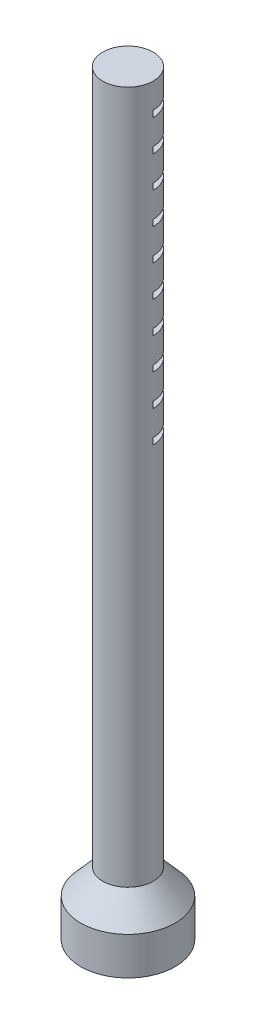
ISO-10303-21;
HEADER;
FILE_DESCRIPTION(('STEP AP214'),'2;1');
FILE_NAME('part.step','',(''),(''),'','','');
FILE_SCHEMA(('AUTOMOTIVE_DESIGN { 1 0 10303 214 1 1 1 1 }'));
ENDSEC;
DATA;
#1=APPLICATION_CONTEXT('core data for automotive mechanical design processes');
#2=APPLICATION_PROTOCOL_DEFINITION('international standard','automotive_design',2000,#1);
#3=PRODUCT_CONTEXT('',#1,'mechanical');
#4=PRODUCT('Part','Part','',(#3));
#5=PRODUCT_RELATED_PRODUCT_CATEGORY('part','',(#4));
#6=PRODUCT_DEFINITION_FORMATION('','',#4);
#7=PRODUCT_DEFINITION_CONTEXT('part definition',#1,'design');
#8=PRODUCT_DEFINITION('design','',#6,#7);
#9=PRODUCT_DEFINITION_SHAPE('','',#8);
#10=(LENGTH_UNIT() NAMED_UNIT(*) SI_UNIT(.MILLI.,.METRE.));
#11=(NAMED_UNIT(*) PLANE_ANGLE_UNIT() SI_UNIT($,.RADIAN.));
#12=(NAMED_UNIT(*) SI_UNIT($,.STERADIAN.) SOLID_ANGLE_UNIT());
#13=UNCERTAINTY_MEASURE_WITH_UNIT(LENGTH_MEASURE(1.E-05),#10,'distance_accuracy_value','');
#14=(GEOMETRIC_REPRESENTATION_CONTEXT(3) GLOBAL_UNCERTAINTY_ASSIGNED_CONTEXT((#13)) GLOBAL_UNIT_ASSIGNED_CONTEXT((#10,
#11,#12)) REPRESENTATION_CONTEXT('',''));
#15=CARTESIAN_POINT('',(0.,0.,0.));
#16=DIRECTION('',(0.,0.,1.));
#17=DIRECTION('',(1.,0.,0.));
#18=AXIS2_PLACEMENT_3D('',#15,#16,#17);
#19=CARTESIAN_POINT('',(0.,-14.747243959559,0.));
#20=DIRECTION('',(0.,1.,0.));
#21=DIRECTION('',(0.,0.,1.));
#22=AXIS2_PLACEMENT_3D('',#19,#20,#21);
#23=PLANE('',#22);
#24=CARTESIAN_POINT('',(0.,-14.747243959559,0.));
#25=DIRECTION('',(0.,1.,0.));
#26=DIRECTION('',(0.,0.,1.));
#27=AXIS2_PLACEMENT_3D('',#24,#25,#26);
#28=CIRCLE('',#27,3.75);
#29=CARTESIAN_POINT('',(0.,-14.747243959559,3.75));
#30=VERTEX_POINT('',#29);
#31=EDGE_CURVE('E384',#30,#30,#28,.T.);
#32=ORIENTED_EDGE('',*,*,#31,.F.);
#33=EDGE_LOOP('',(#32));
#34=FACE_BOUND('',#33,.T.);
#35=ADVANCED_FACE('F33',(#34),#23,.F.);
#36=CARTESIAN_POINT('',(0.,34.0835094533615,0.));
#37=DIRECTION('',(0.,1.,0.));
#38=DIRECTION('',(0.,0.,1.));
#39=AXIS2_PLACEMENT_3D('',#36,#37,#38);
#40=CYLINDRICAL_SURFACE('',#39,3.75);
#41=CARTESIAN_POINT('',(0.,-11.747243959559,0.));
#42=DIRECTION('',(0.,1.,0.));
#43=DIRECTION('',(0.,0.,1.));
#44=AXIS2_PLACEMENT_3D('',#41,#42,#43);
#45=CIRCLE('',#44,3.75000000000001);
#46=CARTESIAN_POINT('',(0.,-11.747243959559,3.75000000000001));
#47=VERTEX_POINT('',#46);
#48=EDGE_CURVE('E381',#47,#47,#45,.T.);
#49=ORIENTED_EDGE('',*,*,#48,.F.);
#50=EDGE_LOOP('',(#49));
#51=FACE_BOUND('',#50,.T.);
#52=ORIENTED_EDGE('',*,*,#31,.T.);
#53=EDGE_LOOP('',(#52));
#54=FACE_BOUND('',#53,.T.);
#55=ADVANCED_FACE('F527',(#51,#54),#40,.T.);
#56=CARTESIAN_POINT('',(0.,-11.747243959559,0.));
#57=DIRECTION('',(0.,-1.,0.));
#58=DIRECTION('',(0.,0.,-1.));
#59=AXIS2_PLACEMENT_3D('',#56,#57,#58);
#60=CONICAL_SURFACE('',#59,3.75000000000001,0.718829999621624);
#61=CARTESIAN_POINT('',(0.,-9.74724395955903,0.));
#62=DIRECTION('',(0.,1.,0.));
#63=DIRECTION('',(0.,0.,1.));
#64=AXIS2_PLACEMENT_3D('',#61,#62,#63);
#65=CIRCLE('',#64,2.00000000000001);
#66=CARTESIAN_POINT('',(0.,-9.74724395955903,2.00000000000001));
#67=VERTEX_POINT('',#66);
#68=EDGE_CURVE('E378',#67,#67,#65,.T.);
#69=ORIENTED_EDGE('',*,*,#68,.F.);
#70=EDGE_LOOP('',(#69));
#71=FACE_BOUND('',#70,.T.);
#72=ORIENTED_EDGE('',*,*,#48,.T.);
#73=EDGE_LOOP('',(#72));
#74=FACE_BOUND('',#73,.T.);
#75=ADVANCED_FACE('F532',(#71,#74),#60,.T.);
#76=CARTESIAN_POINT('',(0.,34.0835094533615,0.));
#77=DIRECTION('',(0.,1.,0.));
#78=DIRECTION('',(0.,0.,1.));
#79=AXIS2_PLACEMENT_3D('',#76,#77,#78);
#80=CYLINDRICAL_SURFACE('',#79,2.00000000000001);
#81=CARTESIAN_POINT('',(0.,22.752756040441,0.));
#82=DIRECTION('',(0.,-1.,0.));
#83=DIRECTION('',(1.,0.,0.));
#84=AXIS2_PLACEMENT_3D('',#81,#82,#83);
#85=CIRCLE('',#84,2.00000000000001);
#86=CARTESIAN_POINT('',(1.01572477307496,22.752756040441,-1.72287642776893));
#87=VERTEX_POINT('',#86);
#88=CARTESIAN_POINT('',(2.00000000000001,22.752756040441,0.));
#89=VERTEX_POINT('',#88);
#90=EDGE_CURVE('E461',#87,#89,#85,.T.);
#91=ORIENTED_EDGE('',*,*,#90,.T.);
#92=DIRECTION('',(0.,1.,0.));
#93=VECTOR('',#92,1.);
#94=CARTESIAN_POINT('',(2.00000000000001,34.0835094533615,0.));
#95=LINE('',#94,#93);
#96=CARTESIAN_POINT('',(2.00000000000001,23.252756040441,0.));
#97=VERTEX_POINT('',#96);
#98=EDGE_CURVE('E478',#89,#97,#95,.T.);
#99=ORIENTED_EDGE('',*,*,#98,.T.);
#100=CARTESIAN_POINT('',(0.,23.252756040441,0.));
#101=DIRECTION('',(0.,1.,0.));
#102=DIRECTION('',(0.,0.,1.));
#103=AXIS2_PLACEMENT_3D('',#100,#101,#102);
#104=CIRCLE('',#103,2.00000000000001);
#105=CARTESIAN_POINT('',(1.01572477307496,23.252756040441,-1.72287642776893));
#106=VERTEX_POINT('',#105);
#107=EDGE_CURVE('E455',#97,#106,#104,.T.);
#108=ORIENTED_EDGE('',*,*,#107,.T.);
#109=DIRECTION('',(0.,1.,0.));
#110=VECTOR('',#109,1.);
#111=CARTESIAN_POINT('',(1.01572477307496,34.0835094533615,-1.72287642776893));
#112=LINE('',#111,#110);
#113=EDGE_CURVE('E458',#106,#87,#112,.F.);
#114=ORIENTED_EDGE('',*,*,#113,.T.);
#115=EDGE_LOOP('',(#91,#99,#108,#114));
#116=FACE_BOUND('',#115,.T.);
#117=CARTESIAN_POINT('',(0.,25.252756040441,0.));
#118=DIRECTION('',(0.,-1.,0.));
#119=DIRECTION('',(1.,0.,0.));
#120=AXIS2_PLACEMENT_3D('',#117,#118,#119);
#121=CIRCLE('',#120,2.00000000000001);
#122=CARTESIAN_POINT('',(1.01572477307494,25.252756040441,-1.72287642776895));
#123=VERTEX_POINT('',#122);
#124=CARTESIAN_POINT('',(2.00000000000001,25.252756040441,0.));
#125=VERTEX_POINT('',#124);
#126=EDGE_CURVE('E452',#123,#125,#121,.T.);
#127=ORIENTED_EDGE('',*,*,#126,.T.);
#128=CARTESIAN_POINT('',(2.00000000000001,25.752756040441,0.));
#129=VERTEX_POINT('',#128);
#130=EDGE_CURVE('E480',#125,#129,#95,.T.);
#131=ORIENTED_EDGE('',*,*,#130,.T.);
#132=CARTESIAN_POINT('',(0.,25.752756040441,0.));
#133=DIRECTION('',(0.,1.,0.));
#134=DIRECTION('',(0.,0.,1.));
#135=AXIS2_PLACEMENT_3D('',#132,#133,#134);
#136=CIRCLE('',#135,2.00000000000001);
#137=CARTESIAN_POINT('',(1.01572477307494,25.752756040441,-1.72287642776895));
#138=VERTEX_POINT('',#137);
#139=EDGE_CURVE('E446',#129,#138,#136,.T.);
#140=ORIENTED_EDGE('',*,*,#139,.T.);
#141=DIRECTION('',(0.,1.,0.));
#142=VECTOR('',#141,1.);
#143=CARTESIAN_POINT('',(1.01572477307494,34.0835094533615,-1.72287642776895));
#144=LINE('',#143,#142);
#145=EDGE_CURVE('E449',#138,#123,#144,.F.);
#146=ORIENTED_EDGE('',*,*,#145,.T.);
#147=EDGE_LOOP('',(#127,#131,#140,#146));
#148=FACE_BOUND('',#147,.T.);
#149=CARTESIAN_POINT('',(0.,27.752756040441,0.));
#150=DIRECTION('',(0.,-1.,0.));
#151=DIRECTION('',(0.,0.,-1.));
#152=AXIS2_PLACEMENT_3D('',#149,#150,#151);
#153=CIRCLE('',#152,2.00000000000001);
#154=CARTESIAN_POINT('',(1.01572477307491,27.752756040441,-1.72287642776896));
#155=VERTEX_POINT('',#154);
#156=CARTESIAN_POINT('',(2.00000000000001,27.752756040441,0.));
#157=VERTEX_POINT('',#156);
#158=EDGE_CURVE('E443',#155,#157,#153,.T.);
#159=ORIENTED_EDGE('',*,*,#158,.T.);
#160=CARTESIAN_POINT('',(2.00000000000001,28.252756040441,0.));
#161=VERTEX_POINT('',#160);
#162=EDGE_CURVE('E483',#157,#161,#95,.T.);
#163=ORIENTED_EDGE('',*,*,#162,.T.);
#164=CARTESIAN_POINT('',(0.,28.252756040441,0.));
#165=DIRECTION('',(0.,1.,0.));
#166=DIRECTION('',(0.,0.,1.));
#167=AXIS2_PLACEMENT_3D('',#164,#165,#166);
#168=CIRCLE('',#167,2.00000000000001);
#169=CARTESIAN_POINT('',(1.01572477307491,28.252756040441,-1.72287642776896));
#170=VERTEX_POINT('',#169);
#171=EDGE_CURVE('E437',#161,#170,#168,.T.);
#172=ORIENTED_EDGE('',*,*,#171,.T.);
#173=DIRECTION('',(0.,1.,0.));
#174=VECTOR('',#173,1.);
#175=CARTESIAN_POINT('',(1.01572477307491,34.0835094533615,-1.72287642776896));
#176=LINE('',#175,#174);
#177=EDGE_CURVE('E440',#170,#155,#176,.F.);
#178=ORIENTED_EDGE('',*,*,#177,.T.);
#179=EDGE_LOOP('',(#159,#163,#172,#178));
#180=FACE_BOUND('',#179,.T.);
#181=CARTESIAN_POINT('',(0.,30.252756040441,0.));
#182=DIRECTION('',(0.,-1.,0.));
#183=DIRECTION('',(1.,0.,0.));
#184=AXIS2_PLACEMENT_3D('',#181,#182,#183);
#185=CIRCLE('',#184,2.00000000000001);
#186=CARTESIAN_POINT('',(1.01572477307488,30.252756040441,-1.72287642776898));
#187=VERTEX_POINT('',#186);
#188=CARTESIAN_POINT('',(2.00000000000001,30.252756040441,0.));
#189=VERTEX_POINT('',#188);
#190=EDGE_CURVE('E434',#187,#189,#185,.T.);
#191=ORIENTED_EDGE('',*,*,#190,.T.);
#192=CARTESIAN_POINT('',(2.00000000000001,30.752756040441,0.));
#193=VERTEX_POINT('',#192);
#194=EDGE_CURVE('E486',#189,#193,#95,.T.);
#195=ORIENTED_EDGE('',*,*,#194,.T.);
#196=CARTESIAN_POINT('',(0.,30.752756040441,0.));
#197=DIRECTION('',(0.,1.,0.));
#198=DIRECTION('',(0.,0.,1.));
#199=AXIS2_PLACEMENT_3D('',#196,#197,#198);
#200=CIRCLE('',#199,2.00000000000001);
#201=CARTESIAN_POINT('',(1.01572477307488,30.752756040441,-1.72287642776898));
#202=VERTEX_POINT('',#201);
#203=EDGE_CURVE('E428',#193,#202,#200,.T.);
#204=ORIENTED_EDGE('',*,*,#203,.T.);
#205=DIRECTION('',(0.,1.,0.));
#206=VECTOR('',#205,1.);
#207=CARTESIAN_POINT('',(1.01572477307488,34.0835094533615,-1.72287642776898));
#208=LINE('',#207,#206);
#209=EDGE_CURVE('E431',#202,#187,#208,.F.);
#210=ORIENTED_EDGE('',*,*,#209,.T.);
#211=EDGE_LOOP('',(#191,#195,#204,#210));
#212=FACE_BOUND('',#211,.T.);
#213=CARTESIAN_POINT('',(0.,32.752756040441,0.));
#214=DIRECTION('',(0.,-1.,0.));
#215=DIRECTION('',(1.,0.,0.));
#216=AXIS2_PLACEMENT_3D('',#213,#214,#215);
#217=CIRCLE('',#216,2.00000000000001);
#218=CARTESIAN_POINT('',(1.01572477307486,32.752756040441,-1.72287642776899));
#219=VERTEX_POINT('',#218);
#220=CARTESIAN_POINT('',(2.00000000000001,32.752756040441,0.));
#221=VERTEX_POINT('',#220);
#222=EDGE_CURVE('E425',#219,#221,#217,.T.);
#223=ORIENTED_EDGE('',*,*,#222,.T.);
#224=CARTESIAN_POINT('',(2.00000000000001,33.252756040441,0.));
#225=VERTEX_POINT('',#224);
#226=EDGE_CURVE('E489',#221,#225,#95,.T.);
#227=ORIENTED_EDGE('',*,*,#226,.T.);
#228=CARTESIAN_POINT('',(0.,33.252756040441,0.));
#229=DIRECTION('',(0.,1.,0.));
#230=DIRECTION('',(0.,0.,1.));
#231=AXIS2_PLACEMENT_3D('',#228,#229,#230);
#232=CIRCLE('',#231,2.00000000000001);
#233=CARTESIAN_POINT('',(1.01572477307486,33.252756040441,-1.72287642776899));
#234=VERTEX_POINT('',#233);
#235=EDGE_CURVE('E419',#225,#234,#232,.T.);
#236=ORIENTED_EDGE('',*,*,#235,.T.);
#237=DIRECTION('',(0.,1.,0.));
#238=VECTOR('',#237,1.);
#239=CARTESIAN_POINT('',(1.01572477307486,34.0835094533615,-1.72287642776899));
#240=LINE('',#239,#238);
#241=EDGE_CURVE('E422',#234,#219,#240,.F.);
#242=ORIENTED_EDGE('',*,*,#241,.T.);
#243=EDGE_LOOP('',(#223,#227,#236,#242));
#244=FACE_BOUND('',#243,.T.);
#245=CARTESIAN_POINT('',(0.,35.252756040441,0.));
#246=DIRECTION('',(0.,-1.,0.));
#247=DIRECTION('',(0.,0.,-1.));
#248=AXIS2_PLACEMENT_3D('',#245,#246,#247);
#249=CIRCLE('',#248,2.00000000000001);
#250=CARTESIAN_POINT('',(1.01572477307483,35.252756040441,-1.72287642776901));
#251=VERTEX_POINT('',#250);
#252=CARTESIAN_POINT('',(2.00000000000001,35.252756040441,0.));
#253=VERTEX_POINT('',#252);
#254=EDGE_CURVE('E416',#251,#253,#249,.T.);
#255=ORIENTED_EDGE('',*,*,#254,.T.);
#256=CARTESIAN_POINT('',(2.00000000000001,35.752756040441,0.));
#257=VERTEX_POINT('',#256);
#258=EDGE_CURVE('E492',#253,#257,#95,.T.);
#259=ORIENTED_EDGE('',*,*,#258,.T.);
#260=CARTESIAN_POINT('',(0.,35.752756040441,0.));
#261=DIRECTION('',(0.,1.,0.));
#262=DIRECTION('',(0.,0.,1.));
#263=AXIS2_PLACEMENT_3D('',#260,#261,#262);
#264=CIRCLE('',#263,2.00000000000001);
#265=CARTESIAN_POINT('',(1.01572477307483,35.752756040441,-1.72287642776901));
#266=VERTEX_POINT('',#265);
#267=EDGE_CURVE('E410',#257,#266,#264,.T.);
#268=ORIENTED_EDGE('',*,*,#267,.T.);
#269=DIRECTION('',(0.,1.,0.));
#270=VECTOR('',#269,1.);
#271=CARTESIAN_POINT('',(1.01572477307483,34.0835094533615,-1.72287642776901));
#272=LINE('',#271,#270);
#273=EDGE_CURVE('E413',#266,#251,#272,.F.);
#274=ORIENTED_EDGE('',*,*,#273,.T.);
#275=EDGE_LOOP('',(#255,#259,#268,#274));
#276=FACE_BOUND('',#275,.T.);
#277=CARTESIAN_POINT('',(0.,37.752756040441,0.));
#278=DIRECTION('',(0.,-1.,0.));
#279=DIRECTION('',(0.,0.,-1.));
#280=AXIS2_PLACEMENT_3D('',#277,#278,#279);
#281=CIRCLE('',#280,2.00000000000001);
#282=CARTESIAN_POINT('',(1.01572477307481,37.752756040441,-1.72287642776902));
#283=VERTEX_POINT('',#282);
#284=CARTESIAN_POINT('',(2.00000000000001,37.752756040441,0.));
#285=VERTEX_POINT('',#284);
#286=EDGE_CURVE('E407',#283,#285,#281,.T.);
#287=ORIENTED_EDGE('',*,*,#286,.T.);
#288=CARTESIAN_POINT('',(2.00000000000001,38.252756040441,0.));
#289=VERTEX_POINT('',#288);
#290=EDGE_CURVE('E495',#285,#289,#95,.T.);
#291=ORIENTED_EDGE('',*,*,#290,.T.);
#292=CARTESIAN_POINT('',(0.,38.252756040441,0.));
#293=DIRECTION('',(0.,1.,0.));
#294=DIRECTION('',(0.,0.,1.));
#295=AXIS2_PLACEMENT_3D('',#292,#293,#294);
#296=CIRCLE('',#295,2.00000000000001);
#297=CARTESIAN_POINT('',(1.01572477307481,38.252756040441,-1.72287642776902));
#298=VERTEX_POINT('',#297);
#299=EDGE_CURVE('E401',#289,#298,#296,.T.);
#300=ORIENTED_EDGE('',*,*,#299,.T.);
#301=DIRECTION('',(0.,1.,0.));
#302=VECTOR('',#301,1.);
#303=CARTESIAN_POINT('',(1.01572477307481,34.0835094533615,-1.72287642776902));
#304=LINE('',#303,#302);
#305=EDGE_CURVE('E404',#298,#283,#304,.F.);
#306=ORIENTED_EDGE('',*,*,#305,.T.);
#307=EDGE_LOOP('',(#287,#291,#300,#306));
#308=FACE_BOUND('',#307,.T.);
#309=CARTESIAN_POINT('',(0.,40.252756040441,0.));
#310=DIRECTION('',(0.,-1.,0.));
#311=DIRECTION('',(1.,0.,0.));
#312=AXIS2_PLACEMENT_3D('',#309,#310,#311);
#313=CIRCLE('',#312,2.00000000000001);
#314=CARTESIAN_POINT('',(1.01572477307478,40.252756040441,-1.72287642776904));
#315=VERTEX_POINT('',#314);
#316=CARTESIAN_POINT('',(2.00000000000001,40.252756040441,0.));
#317=VERTEX_POINT('',#316);
#318=EDGE_CURVE('E398',#315,#317,#313,.T.);
#319=ORIENTED_EDGE('',*,*,#318,.T.);
#320=CARTESIAN_POINT('',(2.00000000000001,40.752756040441,0.));
#321=VERTEX_POINT('',#320);
#322=EDGE_CURVE('E373',#317,#321,#95,.T.);
#323=ORIENTED_EDGE('',*,*,#322,.T.);
#324=CARTESIAN_POINT('',(0.,40.752756040441,0.));
#325=DIRECTION('',(0.,1.,0.));
#326=DIRECTION('',(0.,0.,1.));
#327=AXIS2_PLACEMENT_3D('',#324,#325,#326);
#328=CIRCLE('',#327,2.00000000000001);
#329=CARTESIAN_POINT('',(1.01572477307478,40.752756040441,-1.72287642776904));
#330=VERTEX_POINT('',#329);
#331=EDGE_CURVE('E392',#321,#330,#328,.T.);
#332=ORIENTED_EDGE('',*,*,#331,.T.);
#333=DIRECTION('',(0.,1.,0.));
#334=VECTOR('',#333,1.);
#335=CARTESIAN_POINT('',(1.01572477307478,34.0835094533615,-1.72287642776904));
#336=LINE('',#335,#334);
#337=EDGE_CURVE('E395',#330,#315,#336,.F.);
#338=ORIENTED_EDGE('',*,*,#337,.T.);
#339=EDGE_LOOP('',(#319,#323,#332,#338));
#340=FACE_BOUND('',#339,.T.);
#341=CARTESIAN_POINT('',(0.,42.752756040441,0.));
#342=DIRECTION('',(0.,-1.,0.));
#343=DIRECTION('',(0.,0.,-1.));
#344=AXIS2_PLACEMENT_3D('',#341,#342,#343);
#345=CIRCLE('',#344,2.00000000000001);
#346=CARTESIAN_POINT('',(1.01572477307475,42.752756040441,-1.72287642776906));
#347=VERTEX_POINT('',#346);
#348=CARTESIAN_POINT('',(2.00000000000001,42.752756040441,0.));
#349=VERTEX_POINT('',#348);
#350=EDGE_CURVE('E389',#347,#349,#345,.T.);
#351=ORIENTED_EDGE('',*,*,#350,.T.);
#352=CARTESIAN_POINT('',(2.00000000000001,43.252756040441,0.));
#353=VERTEX_POINT('',#352);
#354=EDGE_CURVE('E336',#349,#353,#95,.T.);
#355=ORIENTED_EDGE('',*,*,#354,.T.);
#356=CARTESIAN_POINT('',(0.,43.252756040441,0.));
#357=DIRECTION('',(0.,1.,0.));
#358=DIRECTION('',(0.,0.,1.));
#359=AXIS2_PLACEMENT_3D('',#356,#357,#358);
#360=CIRCLE('',#359,2.00000000000001);
#361=CARTESIAN_POINT('',(1.01572477307475,43.252756040441,-1.72287642776906));
#362=VERTEX_POINT('',#361);
#363=EDGE_CURVE('E253',#353,#362,#360,.T.);
#364=ORIENTED_EDGE('',*,*,#363,.T.);
#365=DIRECTION('',(0.,1.,0.));
#366=VECTOR('',#365,1.);
#367=CARTESIAN_POINT('',(1.01572477307475,34.0835094533615,-1.72287642776906));
#368=LINE('',#367,#366);
#369=EDGE_CURVE('E237',#362,#347,#368,.F.);
#370=ORIENTED_EDGE('',*,*,#369,.T.);
#371=EDGE_LOOP('',(#351,#355,#364,#370));
#372=FACE_BOUND('',#371,.T.);
#373=CARTESIAN_POINT('',(0.,45.252756040441,0.));
#374=DIRECTION('',(0.,1.,0.));
#375=DIRECTION('',(0.,0.,1.));
#376=AXIS2_PLACEMENT_3D('',#373,#374,#375);
#377=CIRCLE('',#376,2.00000000000001);
#378=CARTESIAN_POINT('',(0.,45.252756040441,2.00000000000001));
#379=VERTEX_POINT('',#378);
#380=EDGE_CURVE('E375',#379,#379,#377,.T.);
#381=ORIENTED_EDGE('',*,*,#380,.F.);
#382=EDGE_LOOP('',(#381));
#383=FACE_BOUND('',#382,.T.);
#384=DIRECTION('',(0.,1.,0.));
#385=VECTOR('',#384,1.);
#386=CARTESIAN_POINT('',(1.01572477307499,34.0835094533615,-1.72287642776892));
#387=LINE('',#386,#385);
#388=CARTESIAN_POINT('',(1.01572477307499,20.752756040441,-1.72287642776892));
#389=VERTEX_POINT('',#388);
#390=CARTESIAN_POINT('',(1.01572477307499,20.252756040441,-1.72287642776892));
#391=VERTEX_POINT('',#390);
#392=EDGE_CURVE('E40',#389,#391,#387,.F.);
#393=ORIENTED_EDGE('',*,*,#392,.T.);
#394=CARTESIAN_POINT('',(0.,20.252756040441,0.));
#395=DIRECTION('',(0.,-1.,0.));
#396=DIRECTION('',(0.,0.,-1.));
#397=AXIS2_PLACEMENT_3D('',#394,#395,#396);
#398=CIRCLE('',#397,2.00000000000001);
#399=CARTESIAN_POINT('',(2.00000000000001,20.252756040441,0.));
#400=VERTEX_POINT('',#399);
#401=EDGE_CURVE('E11',#391,#400,#398,.T.);
#402=ORIENTED_EDGE('',*,*,#401,.T.);
#403=CARTESIAN_POINT('',(2.00000000000001,20.752756040441,0.));
#404=VERTEX_POINT('',#403);
#405=EDGE_CURVE('E374',#400,#404,#95,.T.);
#406=ORIENTED_EDGE('',*,*,#405,.T.);
#407=CARTESIAN_POINT('',(0.,20.752756040441,0.));
#408=DIRECTION('',(0.,1.,0.));
#409=DIRECTION('',(0.,0.,1.));
#410=AXIS2_PLACEMENT_3D('',#407,#408,#409);
#411=CIRCLE('',#410,2.00000000000001);
#412=EDGE_CURVE('E464',#404,#389,#411,.T.);
#413=ORIENTED_EDGE('',*,*,#412,.T.);
#414=EDGE_LOOP('',(#393,#402,#406,#413));
#415=FACE_BOUND('',#414,.T.);
#416=ORIENTED_EDGE('',*,*,#68,.T.);
#417=EDGE_LOOP('',(#416));
#418=FACE_BOUND('',#417,.T.);
#419=ADVANCED_FACE('F468',(#116,#148,#180,#212,#244,#276,#308,#340,#372,#383,#415,#418),#80,.T.);
#420=CARTESIAN_POINT('',(2.00000000000001,45.252756040441,0.));
#421=DIRECTION('',(0.,-1.,0.));
#422=DIRECTION('',(0.,0.,-1.));
#423=AXIS2_PLACEMENT_3D('',#420,#421,#422);
#424=PLANE('',#423);
#425=ORIENTED_EDGE('',*,*,#380,.T.);
#426=EDGE_LOOP('',(#425));
#427=FACE_BOUND('',#426,.T.);
#428=ADVANCED_FACE('F545',(#427),#424,.F.);
#429=CARTESIAN_POINT('',(0.,0.,0.));
#430=DIRECTION('',(0.,0.,1.));
#431=DIRECTION('',(1.,0.,0.));
#432=AXIS2_PLACEMENT_3D('',#429,#430,#431);
#433=PLANE('',#432);
#434=DIRECTION('',(1.,0.,0.));
#435=VECTOR('',#434,1.);
#436=CARTESIAN_POINT('',(1.01572477307475,42.752756040441,0.));
#437=LINE('',#436,#435);
#438=CARTESIAN_POINT('',(1.01572477307475,42.752756040441,0.));
#439=VERTEX_POINT('',#438);
#440=EDGE_CURVE('E250',#439,#349,#437,.T.);
#441=ORIENTED_EDGE('',*,*,#440,.F.);
#442=DIRECTION('',(0.,-1.,0.));
#443=VECTOR('',#442,1.);
#444=CARTESIAN_POINT('',(1.01572477307475,43.252756040441,0.));
#445=LINE('',#444,#443);
#446=CARTESIAN_POINT('',(1.01572477307475,43.252756040441,0.));
#447=VERTEX_POINT('',#446);
#448=EDGE_CURVE('E235',#447,#439,#445,.T.);
#449=ORIENTED_EDGE('',*,*,#448,.F.);
#450=DIRECTION('',(-1.,0.,0.));
#451=VECTOR('',#450,1.);
#452=CARTESIAN_POINT('',(2.00000000000001,43.252756040441,0.));
#453=LINE('',#452,#451);
#454=EDGE_CURVE('E248',#353,#447,#453,.T.);
#455=ORIENTED_EDGE('',*,*,#454,.F.);
#456=ORIENTED_EDGE('',*,*,#354,.F.);
#457=EDGE_LOOP('',(#441,#449,#455,#456));
#458=FACE_BOUND('',#457,.T.);
#459=ADVANCED_FACE('F247',(#458),#433,.F.);
#460=CARTESIAN_POINT('',(2.00000000000001,43.252756040441,-3.75000000000001));
#461=DIRECTION('',(0.,1.,0.));
#462=DIRECTION('',(0.,0.,1.));
#463=AXIS2_PLACEMENT_3D('',#460,#461,#462);
#464=PLANE('',#463);
#465=ORIENTED_EDGE('',*,*,#454,.T.);
#466=DIRECTION('',(0.,0.,1.));
#467=VECTOR('',#466,1.);
#468=CARTESIAN_POINT('',(1.01572477307475,43.252756040441,-3.75000000000001));
#469=LINE('',#468,#467);
#470=EDGE_CURVE('E231',#362,#447,#469,.T.);
#471=ORIENTED_EDGE('',*,*,#470,.F.);
#472=ORIENTED_EDGE('',*,*,#363,.F.);
#473=EDGE_LOOP('',(#465,#471,#472));
#474=FACE_BOUND('',#473,.T.);
#475=ADVANCED_FACE('F252',(#474),#464,.F.);
#476=CARTESIAN_POINT('',(1.01572477307475,43.252756040441,-3.75000000000001));
#477=DIRECTION('',(-1.,0.,0.));
#478=DIRECTION('',(0.,0.,1.));
#479=AXIS2_PLACEMENT_3D('',#476,#477,#478);
#480=PLANE('',#479);
#481=ORIENTED_EDGE('',*,*,#470,.T.);
#482=ORIENTED_EDGE('',*,*,#448,.T.);
#483=DIRECTION('',(0.,0.,1.));
#484=VECTOR('',#483,1.);
#485=CARTESIAN_POINT('',(1.01572477307475,42.752756040441,-3.75000000000001));
#486=LINE('',#485,#484);
#487=EDGE_CURVE('E242',#347,#439,#486,.T.);
#488=ORIENTED_EDGE('',*,*,#487,.F.);
#489=ORIENTED_EDGE('',*,*,#369,.F.);
#490=EDGE_LOOP('',(#481,#482,#488,#489));
#491=FACE_BOUND('',#490,.T.);
#492=ADVANCED_FACE('F233',(#491),#480,.F.);
#493=CARTESIAN_POINT('',(1.01572477307475,42.752756040441,-3.75000000000001));
#494=DIRECTION('',(0.,-1.,0.));
#495=DIRECTION('',(0.,0.,-1.));
#496=AXIS2_PLACEMENT_3D('',#493,#494,#495);
#497=PLANE('',#496);
#498=ORIENTED_EDGE('',*,*,#487,.T.);
#499=ORIENTED_EDGE('',*,*,#440,.T.);
#500=ORIENTED_EDGE('',*,*,#350,.F.);
#501=EDGE_LOOP('',(#498,#499,#500));
#502=FACE_BOUND('',#501,.T.);
#503=ADVANCED_FACE('F522',(#502),#497,.F.);
#504=DIRECTION('',(1.,0.,0.));
#505=VECTOR('',#504,1.);
#506=CARTESIAN_POINT('',(1.01572477307478,40.252756040441,0.));
#507=LINE('',#506,#505);
#508=CARTESIAN_POINT('',(1.01572477307478,40.252756040441,0.));
#509=VERTEX_POINT('',#508);
#510=EDGE_CURVE('E264',#509,#317,#507,.T.);
#511=ORIENTED_EDGE('',*,*,#510,.F.);
#512=DIRECTION('',(0.,-1.,0.));
#513=VECTOR('',#512,1.);
#514=CARTESIAN_POINT('',(1.01572477307478,40.752756040441,0.));
#515=LINE('',#514,#513);
#516=CARTESIAN_POINT('',(1.01572477307478,40.752756040441,0.));
#517=VERTEX_POINT('',#516);
#518=EDGE_CURVE('E261',#517,#509,#515,.T.);
#519=ORIENTED_EDGE('',*,*,#518,.F.);
#520=DIRECTION('',(-1.,0.,0.));
#521=VECTOR('',#520,1.);
#522=CARTESIAN_POINT('',(2.00000000000003,40.752756040441,0.));
#523=LINE('',#522,#521);
#524=EDGE_CURVE('E258',#321,#517,#523,.T.);
#525=ORIENTED_EDGE('',*,*,#524,.F.);
#526=ORIENTED_EDGE('',*,*,#322,.F.);
#527=EDGE_LOOP('',(#511,#519,#525,#526));
#528=FACE_BOUND('',#527,.T.);
#529=ADVANCED_FACE('F505',(#528),#433,.F.);
#530=CARTESIAN_POINT('',(2.00000000000003,40.752756040441,-3.75000000000001));
#531=DIRECTION('',(0.,1.,0.));
#532=DIRECTION('',(0.,0.,1.));
#533=AXIS2_PLACEMENT_3D('',#530,#531,#532);
#534=PLANE('',#533);
#535=ORIENTED_EDGE('',*,*,#524,.T.);
#536=DIRECTION('',(0.,0.,1.));
#537=VECTOR('',#536,1.);
#538=CARTESIAN_POINT('',(1.01572477307478,40.752756040441,-3.75000000000001));
#539=LINE('',#538,#537);
#540=EDGE_CURVE('E369',#330,#517,#539,.T.);
#541=ORIENTED_EDGE('',*,*,#540,.F.);
#542=ORIENTED_EDGE('',*,*,#331,.F.);
#543=EDGE_LOOP('',(#535,#541,#542));
#544=FACE_BOUND('',#543,.T.);
#545=ADVANCED_FACE('F514',(#544),#534,.F.);
#546=CARTESIAN_POINT('',(1.01572477307478,40.752756040441,-3.75000000000001));
#547=DIRECTION('',(-1.,0.,0.));
#548=DIRECTION('',(0.,0.,1.));
#549=AXIS2_PLACEMENT_3D('',#546,#547,#548);
#550=PLANE('',#549);
#551=ORIENTED_EDGE('',*,*,#540,.T.);
#552=ORIENTED_EDGE('',*,*,#518,.T.);
#553=DIRECTION('',(0.,0.,1.));
#554=VECTOR('',#553,1.);
#555=CARTESIAN_POINT('',(1.01572477307478,40.252756040441,-3.75000000000001));
#556=LINE('',#555,#554);
#557=EDGE_CURVE('E367',#315,#509,#556,.T.);
#558=ORIENTED_EDGE('',*,*,#557,.F.);
#559=ORIENTED_EDGE('',*,*,#337,.F.);
#560=EDGE_LOOP('',(#551,#552,#558,#559));
#561=FACE_BOUND('',#560,.T.);
#562=ADVANCED_FACE('F511',(#561),#550,.F.);
#563=CARTESIAN_POINT('',(1.01572477307478,40.252756040441,-3.75000000000001));
#564=DIRECTION('',(0.,-1.,0.));
#565=DIRECTION('',(1.,0.,0.));
#566=AXIS2_PLACEMENT_3D('',#563,#564,#565);
#567=PLANE('',#566);
#568=ORIENTED_EDGE('',*,*,#557,.T.);
#569=ORIENTED_EDGE('',*,*,#510,.T.);
#570=ORIENTED_EDGE('',*,*,#318,.F.);
#571=EDGE_LOOP('',(#568,#569,#570));
#572=FACE_BOUND('',#571,.T.);
#573=ADVANCED_FACE('F508',(#572),#567,.F.);
#574=DIRECTION('',(1.,0.,0.));
#575=VECTOR('',#574,1.);
#576=CARTESIAN_POINT('',(1.01572477307481,37.752756040441,0.));
#577=LINE('',#576,#575);
#578=CARTESIAN_POINT('',(1.01572477307481,37.752756040441,0.));
#579=VERTEX_POINT('',#578);
#580=EDGE_CURVE('E273',#579,#285,#577,.T.);
#581=ORIENTED_EDGE('',*,*,#580,.F.);
#582=DIRECTION('',(0.,-1.,0.));
#583=VECTOR('',#582,1.);
#584=CARTESIAN_POINT('',(1.01572477307481,38.252756040441,0.));
#585=LINE('',#584,#583);
#586=CARTESIAN_POINT('',(1.01572477307481,38.252756040441,0.));
#587=VERTEX_POINT('',#586);
#588=EDGE_CURVE('E270',#587,#579,#585,.T.);
#589=ORIENTED_EDGE('',*,*,#588,.F.);
#590=DIRECTION('',(-1.,0.,0.));
#591=VECTOR('',#590,1.);
#592=CARTESIAN_POINT('',(2.00000000000006,38.252756040441,0.));
#593=LINE('',#592,#591);
#594=EDGE_CURVE('E267',#289,#587,#593,.T.);
#595=ORIENTED_EDGE('',*,*,#594,.F.);
#596=ORIENTED_EDGE('',*,*,#290,.F.);
#597=EDGE_LOOP('',(#581,#589,#595,#596));
#598=FACE_BOUND('',#597,.T.);
#599=ADVANCED_FACE('F524',(#598),#433,.F.);
#600=CARTESIAN_POINT('',(2.00000000000006,38.252756040441,-3.75000000000001));
#601=DIRECTION('',(0.,1.,0.));
#602=DIRECTION('',(0.,0.,1.));
#603=AXIS2_PLACEMENT_3D('',#600,#601,#602);
#604=PLANE('',#603);
#605=ORIENTED_EDGE('',*,*,#594,.T.);
#606=DIRECTION('',(0.,0.,1.));
#607=VECTOR('',#606,1.);
#608=CARTESIAN_POINT('',(1.01572477307481,38.252756040441,-3.75000000000001));
#609=LINE('',#608,#607);
#610=EDGE_CURVE('E365',#298,#587,#609,.T.);
#611=ORIENTED_EDGE('',*,*,#610,.F.);
#612=ORIENTED_EDGE('',*,*,#299,.F.);
#613=EDGE_LOOP('',(#605,#611,#612));
#614=FACE_BOUND('',#613,.T.);
#615=ADVANCED_FACE('F591',(#614),#604,.F.);
#616=CARTESIAN_POINT('',(1.01572477307481,38.252756040441,-3.75000000000001));
#617=DIRECTION('',(-1.,0.,0.));
#618=DIRECTION('',(0.,0.,1.));
#619=AXIS2_PLACEMENT_3D('',#616,#617,#618);
#620=PLANE('',#619);
#621=ORIENTED_EDGE('',*,*,#610,.T.);
#622=ORIENTED_EDGE('',*,*,#588,.T.);
#623=DIRECTION('',(0.,0.,1.));
#624=VECTOR('',#623,1.);
#625=CARTESIAN_POINT('',(1.01572477307481,37.752756040441,-3.75000000000001));
#626=LINE('',#625,#624);
#627=EDGE_CURVE('E363',#283,#579,#626,.T.);
#628=ORIENTED_EDGE('',*,*,#627,.F.);
#629=ORIENTED_EDGE('',*,*,#305,.F.);
#630=EDGE_LOOP('',(#621,#622,#628,#629));
#631=FACE_BOUND('',#630,.T.);
#632=ADVANCED_FACE('F601',(#631),#620,.F.);
#633=CARTESIAN_POINT('',(1.01572477307481,37.752756040441,-3.75000000000001));
#634=DIRECTION('',(0.,-1.,0.));
#635=DIRECTION('',(0.,0.,-1.));
#636=AXIS2_PLACEMENT_3D('',#633,#634,#635);
#637=PLANE('',#636);
#638=ORIENTED_EDGE('',*,*,#627,.T.);
#639=ORIENTED_EDGE('',*,*,#580,.T.);
#640=ORIENTED_EDGE('',*,*,#286,.F.);
#641=EDGE_LOOP('',(#638,#639,#640));
#642=FACE_BOUND('',#641,.T.);
#643=ADVANCED_FACE('F611',(#642),#637,.F.);
#644=DIRECTION('',(1.,0.,0.));
#645=VECTOR('',#644,1.);
#646=CARTESIAN_POINT('',(1.01572477307483,35.252756040441,0.));
#647=LINE('',#646,#645);
#648=CARTESIAN_POINT('',(1.01572477307483,35.252756040441,0.));
#649=VERTEX_POINT('',#648);
#650=EDGE_CURVE('E282',#649,#253,#647,.T.);
#651=ORIENTED_EDGE('',*,*,#650,.F.);
#652=DIRECTION('',(0.,-1.,0.));
#653=VECTOR('',#652,1.);
#654=CARTESIAN_POINT('',(1.01572477307483,35.752756040441,0.));
#655=LINE('',#654,#653);
#656=CARTESIAN_POINT('',(1.01572477307483,35.752756040441,0.));
#657=VERTEX_POINT('',#656);
#658=EDGE_CURVE('E279',#657,#649,#655,.T.);
#659=ORIENTED_EDGE('',*,*,#658,.F.);
#660=DIRECTION('',(-1.,0.,0.));
#661=VECTOR('',#660,1.);
#662=CARTESIAN_POINT('',(2.00000000000008,35.752756040441,0.));
#663=LINE('',#662,#661);
#664=EDGE_CURVE('E276',#257,#657,#663,.T.);
#665=ORIENTED_EDGE('',*,*,#664,.F.);
#666=ORIENTED_EDGE('',*,*,#258,.F.);
#667=EDGE_LOOP('',(#651,#659,#665,#666));
#668=FACE_BOUND('',#667,.T.);
#669=ADVANCED_FACE('F593',(#668),#433,.F.);
#670=CARTESIAN_POINT('',(2.00000000000008,35.752756040441,-3.75000000000001));
#671=DIRECTION('',(0.,1.,0.));
#672=DIRECTION('',(0.,0.,1.));
#673=AXIS2_PLACEMENT_3D('',#670,#671,#672);
#674=PLANE('',#673);
#675=ORIENTED_EDGE('',*,*,#664,.T.);
#676=DIRECTION('',(0.,0.,1.));
#677=VECTOR('',#676,1.);
#678=CARTESIAN_POINT('',(1.01572477307483,35.752756040441,-3.75000000000001));
#679=LINE('',#678,#677);
#680=EDGE_CURVE('E361',#266,#657,#679,.T.);
#681=ORIENTED_EDGE('',*,*,#680,.F.);
#682=ORIENTED_EDGE('',*,*,#267,.F.);
#683=EDGE_LOOP('',(#675,#681,#682));
#684=FACE_BOUND('',#683,.T.);
#685=ADVANCED_FACE('F630',(#684),#674,.F.);
#686=CARTESIAN_POINT('',(1.01572477307483,35.752756040441,-3.75000000000001));
#687=DIRECTION('',(-1.,0.,0.));
#688=DIRECTION('',(0.,0.,1.));
#689=AXIS2_PLACEMENT_3D('',#686,#687,#688);
#690=PLANE('',#689);
#691=ORIENTED_EDGE('',*,*,#680,.T.);
#692=ORIENTED_EDGE('',*,*,#658,.T.);
#693=DIRECTION('',(0.,0.,1.));
#694=VECTOR('',#693,1.);
#695=CARTESIAN_POINT('',(1.01572477307483,35.252756040441,-3.75000000000001));
#696=LINE('',#695,#694);
#697=EDGE_CURVE('E359',#251,#649,#696,.T.);
#698=ORIENTED_EDGE('',*,*,#697,.F.);
#699=ORIENTED_EDGE('',*,*,#273,.F.);
#700=EDGE_LOOP('',(#691,#692,#698,#699));
#701=FACE_BOUND('',#700,.T.);
#702=ADVANCED_FACE('F640',(#701),#690,.F.);
#703=CARTESIAN_POINT('',(1.01572477307483,35.252756040441,-3.75000000000001));
#704=DIRECTION('',(0.,-1.,0.));
#705=DIRECTION('',(0.,0.,-1.));
#706=AXIS2_PLACEMENT_3D('',#703,#704,#705);
#707=PLANE('',#706);
#708=ORIENTED_EDGE('',*,*,#697,.T.);
#709=ORIENTED_EDGE('',*,*,#650,.T.);
#710=ORIENTED_EDGE('',*,*,#254,.F.);
#711=EDGE_LOOP('',(#708,#709,#710));
#712=FACE_BOUND('',#711,.T.);
#713=ADVANCED_FACE('F650',(#712),#707,.F.);
#714=DIRECTION('',(1.,0.,0.));
#715=VECTOR('',#714,1.);
#716=CARTESIAN_POINT('',(1.01572477307486,32.752756040441,0.));
#717=LINE('',#716,#715);
#718=CARTESIAN_POINT('',(1.01572477307486,32.752756040441,0.));
#719=VERTEX_POINT('',#718);
#720=EDGE_CURVE('E291',#719,#221,#717,.T.);
#721=ORIENTED_EDGE('',*,*,#720,.F.);
#722=DIRECTION('',(0.,-1.,0.));
#723=VECTOR('',#722,1.);
#724=CARTESIAN_POINT('',(1.01572477307486,33.252756040441,0.));
#725=LINE('',#724,#723);
#726=CARTESIAN_POINT('',(1.01572477307486,33.252756040441,0.));
#727=VERTEX_POINT('',#726);
#728=EDGE_CURVE('E288',#727,#719,#725,.T.);
#729=ORIENTED_EDGE('',*,*,#728,.F.);
#730=DIRECTION('',(-1.,0.,0.));
#731=VECTOR('',#730,1.);
#732=CARTESIAN_POINT('',(2.00000000000011,33.252756040441,0.));
#733=LINE('',#732,#731);
#734=EDGE_CURVE('E285',#225,#727,#733,.T.);
#735=ORIENTED_EDGE('',*,*,#734,.F.);
#736=ORIENTED_EDGE('',*,*,#226,.F.);
#737=EDGE_LOOP('',(#721,#729,#735,#736));
#738=FACE_BOUND('',#737,.T.);
#739=ADVANCED_FACE('F632',(#738),#433,.F.);
#740=CARTESIAN_POINT('',(2.00000000000011,33.252756040441,-3.75000000000001));
#741=DIRECTION('',(0.,1.,0.));
#742=DIRECTION('',(0.,0.,1.));
#743=AXIS2_PLACEMENT_3D('',#740,#741,#742);
#744=PLANE('',#743);
#745=ORIENTED_EDGE('',*,*,#734,.T.);
#746=DIRECTION('',(0.,0.,1.));
#747=VECTOR('',#746,1.);
#748=CARTESIAN_POINT('',(1.01572477307486,33.252756040441,-3.75000000000001));
#749=LINE('',#748,#747);
#750=EDGE_CURVE('E357',#234,#727,#749,.T.);
#751=ORIENTED_EDGE('',*,*,#750,.F.);
#752=ORIENTED_EDGE('',*,*,#235,.F.);
#753=EDGE_LOOP('',(#745,#751,#752));
#754=FACE_BOUND('',#753,.T.);
#755=ADVANCED_FACE('F669',(#754),#744,.F.);
#756=CARTESIAN_POINT('',(1.01572477307486,33.252756040441,-3.75000000000001));
#757=DIRECTION('',(-1.,0.,0.));
#758=DIRECTION('',(0.,0.,1.));
#759=AXIS2_PLACEMENT_3D('',#756,#757,#758);
#760=PLANE('',#759);
#761=ORIENTED_EDGE('',*,*,#750,.T.);
#762=ORIENTED_EDGE('',*,*,#728,.T.);
#763=DIRECTION('',(0.,0.,1.));
#764=VECTOR('',#763,1.);
#765=CARTESIAN_POINT('',(1.01572477307486,32.752756040441,-3.75000000000001));
#766=LINE('',#765,#764);
#767=EDGE_CURVE('E355',#219,#719,#766,.T.);
#768=ORIENTED_EDGE('',*,*,#767,.F.);
#769=ORIENTED_EDGE('',*,*,#241,.F.);
#770=EDGE_LOOP('',(#761,#762,#768,#769));
#771=FACE_BOUND('',#770,.T.);
#772=ADVANCED_FACE('F679',(#771),#760,.F.);
#773=CARTESIAN_POINT('',(1.01572477307486,32.752756040441,-3.75000000000001));
#774=DIRECTION('',(0.,-1.,0.));
#775=DIRECTION('',(1.,0.,0.));
#776=AXIS2_PLACEMENT_3D('',#773,#774,#775);
#777=PLANE('',#776);
#778=ORIENTED_EDGE('',*,*,#767,.T.);
#779=ORIENTED_EDGE('',*,*,#720,.T.);
#780=ORIENTED_EDGE('',*,*,#222,.F.);
#781=EDGE_LOOP('',(#778,#779,#780));
#782=FACE_BOUND('',#781,.T.);
#783=ADVANCED_FACE('F689',(#782),#777,.F.);
#784=DIRECTION('',(1.,0.,0.));
#785=VECTOR('',#784,1.);
#786=CARTESIAN_POINT('',(1.01572477307488,30.252756040441,0.));
#787=LINE('',#786,#785);
#788=CARTESIAN_POINT('',(1.01572477307488,30.252756040441,0.));
#789=VERTEX_POINT('',#788);
#790=EDGE_CURVE('E300',#789,#189,#787,.T.);
#791=ORIENTED_EDGE('',*,*,#790,.F.);
#792=DIRECTION('',(0.,-1.,0.));
#793=VECTOR('',#792,1.);
#794=CARTESIAN_POINT('',(1.01572477307488,30.752756040441,0.));
#795=LINE('',#794,#793);
#796=CARTESIAN_POINT('',(1.01572477307488,30.752756040441,0.));
#797=VERTEX_POINT('',#796);
#798=EDGE_CURVE('E297',#797,#789,#795,.T.);
#799=ORIENTED_EDGE('',*,*,#798,.F.);
#800=DIRECTION('',(-1.,0.,0.));
#801=VECTOR('',#800,1.);
#802=CARTESIAN_POINT('',(2.00000000000014,30.752756040441,0.));
#803=LINE('',#802,#801);
#804=EDGE_CURVE('E294',#193,#797,#803,.T.);
#805=ORIENTED_EDGE('',*,*,#804,.F.);
#806=ORIENTED_EDGE('',*,*,#194,.F.);
#807=EDGE_LOOP('',(#791,#799,#805,#806));
#808=FACE_BOUND('',#807,.T.);
#809=ADVANCED_FACE('F671',(#808),#433,.F.);
#810=CARTESIAN_POINT('',(2.00000000000014,30.752756040441,-3.75000000000001));
#811=DIRECTION('',(0.,1.,0.));
#812=DIRECTION('',(0.,0.,1.));
#813=AXIS2_PLACEMENT_3D('',#810,#811,#812);
#814=PLANE('',#813);
#815=ORIENTED_EDGE('',*,*,#804,.T.);
#816=DIRECTION('',(0.,0.,1.));
#817=VECTOR('',#816,1.);
#818=CARTESIAN_POINT('',(1.01572477307488,30.752756040441,-3.75000000000001));
#819=LINE('',#818,#817);
#820=EDGE_CURVE('E353',#202,#797,#819,.T.);
#821=ORIENTED_EDGE('',*,*,#820,.F.);
#822=ORIENTED_EDGE('',*,*,#203,.F.);
#823=EDGE_LOOP('',(#815,#821,#822));
#824=FACE_BOUND('',#823,.T.);
#825=ADVANCED_FACE('F708',(#824),#814,.F.);
#826=CARTESIAN_POINT('',(1.01572477307488,30.752756040441,-3.75000000000001));
#827=DIRECTION('',(-1.,0.,0.));
#828=DIRECTION('',(0.,0.,1.));
#829=AXIS2_PLACEMENT_3D('',#826,#827,#828);
#830=PLANE('',#829);
#831=ORIENTED_EDGE('',*,*,#820,.T.);
#832=ORIENTED_EDGE('',*,*,#798,.T.);
#833=DIRECTION('',(0.,0.,1.));
#834=VECTOR('',#833,1.);
#835=CARTESIAN_POINT('',(1.01572477307488,30.252756040441,-3.75000000000001));
#836=LINE('',#835,#834);
#837=EDGE_CURVE('E351',#187,#789,#836,.T.);
#838=ORIENTED_EDGE('',*,*,#837,.F.);
#839=ORIENTED_EDGE('',*,*,#209,.F.);
#840=EDGE_LOOP('',(#831,#832,#838,#839));
#841=FACE_BOUND('',#840,.T.);
#842=ADVANCED_FACE('F718',(#841),#830,.F.);
#843=CARTESIAN_POINT('',(1.01572477307488,30.252756040441,-3.75000000000001));
#844=DIRECTION('',(0.,-1.,0.));
#845=DIRECTION('',(1.,0.,0.));
#846=AXIS2_PLACEMENT_3D('',#843,#844,#845);
#847=PLANE('',#846);
#848=ORIENTED_EDGE('',*,*,#837,.T.);
#849=ORIENTED_EDGE('',*,*,#790,.T.);
#850=ORIENTED_EDGE('',*,*,#190,.F.);
#851=EDGE_LOOP('',(#848,#849,#850));
#852=FACE_BOUND('',#851,.T.);
#853=ADVANCED_FACE('F728',(#852),#847,.F.);
#854=DIRECTION('',(1.,0.,0.));
#855=VECTOR('',#854,1.);
#856=CARTESIAN_POINT('',(1.01572477307491,27.752756040441,0.));
#857=LINE('',#856,#855);
#858=CARTESIAN_POINT('',(1.01572477307491,27.752756040441,0.));
#859=VERTEX_POINT('',#858);
#860=EDGE_CURVE('E309',#859,#157,#857,.T.);
#861=ORIENTED_EDGE('',*,*,#860,.F.);
#862=DIRECTION('',(0.,-1.,0.));
#863=VECTOR('',#862,1.);
#864=CARTESIAN_POINT('',(1.01572477307491,28.252756040441,0.));
#865=LINE('',#864,#863);
#866=CARTESIAN_POINT('',(1.01572477307491,28.252756040441,0.));
#867=VERTEX_POINT('',#866);
#868=EDGE_CURVE('E306',#867,#859,#865,.T.);
#869=ORIENTED_EDGE('',*,*,#868,.F.);
#870=DIRECTION('',(-1.,0.,0.));
#871=VECTOR('',#870,1.);
#872=CARTESIAN_POINT('',(2.00000000000016,28.252756040441,0.));
#873=LINE('',#872,#871);
#874=EDGE_CURVE('E303',#161,#867,#873,.T.);
#875=ORIENTED_EDGE('',*,*,#874,.F.);
#876=ORIENTED_EDGE('',*,*,#162,.F.);
#877=EDGE_LOOP('',(#861,#869,#875,#876));
#878=FACE_BOUND('',#877,.T.);
#879=ADVANCED_FACE('F710',(#878),#433,.F.);
#880=CARTESIAN_POINT('',(2.00000000000016,28.252756040441,-3.75000000000001));
#881=DIRECTION('',(0.,1.,0.));
#882=DIRECTION('',(0.,0.,1.));
#883=AXIS2_PLACEMENT_3D('',#880,#881,#882);
#884=PLANE('',#883);
#885=ORIENTED_EDGE('',*,*,#874,.T.);
#886=DIRECTION('',(0.,0.,1.));
#887=VECTOR('',#886,1.);
#888=CARTESIAN_POINT('',(1.01572477307491,28.252756040441,-3.75000000000001));
#889=LINE('',#888,#887);
#890=EDGE_CURVE('E349',#170,#867,#889,.T.);
#891=ORIENTED_EDGE('',*,*,#890,.F.);
#892=ORIENTED_EDGE('',*,*,#171,.F.);
#893=EDGE_LOOP('',(#885,#891,#892));
#894=FACE_BOUND('',#893,.T.);
#895=ADVANCED_FACE('F747',(#894),#884,.F.);
#896=CARTESIAN_POINT('',(1.01572477307491,28.252756040441,-3.75000000000001));
#897=DIRECTION('',(-1.,0.,0.));
#898=DIRECTION('',(0.,0.,1.));
#899=AXIS2_PLACEMENT_3D('',#896,#897,#898);
#900=PLANE('',#899);
#901=ORIENTED_EDGE('',*,*,#890,.T.);
#902=ORIENTED_EDGE('',*,*,#868,.T.);
#903=DIRECTION('',(0.,0.,1.));
#904=VECTOR('',#903,1.);
#905=CARTESIAN_POINT('',(1.01572477307491,27.752756040441,-3.75000000000001));
#906=LINE('',#905,#904);
#907=EDGE_CURVE('E347',#155,#859,#906,.T.);
#908=ORIENTED_EDGE('',*,*,#907,.F.);
#909=ORIENTED_EDGE('',*,*,#177,.F.);
#910=EDGE_LOOP('',(#901,#902,#908,#909));
#911=FACE_BOUND('',#910,.T.);
#912=ADVANCED_FACE('F757',(#911),#900,.F.);
#913=CARTESIAN_POINT('',(1.01572477307491,27.752756040441,-3.75000000000001));
#914=DIRECTION('',(0.,-1.,0.));
#915=DIRECTION('',(0.,0.,-1.));
#916=AXIS2_PLACEMENT_3D('',#913,#914,#915);
#917=PLANE('',#916);
#918=ORIENTED_EDGE('',*,*,#907,.T.);
#919=ORIENTED_EDGE('',*,*,#860,.T.);
#920=ORIENTED_EDGE('',*,*,#158,.F.);
#921=EDGE_LOOP('',(#918,#919,#920));
#922=FACE_BOUND('',#921,.T.);
#923=ADVANCED_FACE('F767',(#922),#917,.F.);
#924=DIRECTION('',(1.,0.,0.));
#925=VECTOR('',#924,1.);
#926=CARTESIAN_POINT('',(1.01572477307494,25.252756040441,0.));
#927=LINE('',#926,#925);
#928=CARTESIAN_POINT('',(1.01572477307494,25.252756040441,0.));
#929=VERTEX_POINT('',#928);
#930=EDGE_CURVE('E318',#929,#125,#927,.T.);
#931=ORIENTED_EDGE('',*,*,#930,.F.);
#932=DIRECTION('',(0.,-1.,0.));
#933=VECTOR('',#932,1.);
#934=CARTESIAN_POINT('',(1.01572477307494,25.752756040441,0.));
#935=LINE('',#934,#933);
#936=CARTESIAN_POINT('',(1.01572477307494,25.752756040441,0.));
#937=VERTEX_POINT('',#936);
#938=EDGE_CURVE('E315',#937,#929,#935,.T.);
#939=ORIENTED_EDGE('',*,*,#938,.F.);
#940=DIRECTION('',(-1.,0.,0.));
#941=VECTOR('',#940,1.);
#942=CARTESIAN_POINT('',(2.00000000000019,25.752756040441,0.));
#943=LINE('',#942,#941);
#944=EDGE_CURVE('E312',#129,#937,#943,.T.);
#945=ORIENTED_EDGE('',*,*,#944,.F.);
#946=ORIENTED_EDGE('',*,*,#130,.F.);
#947=EDGE_LOOP('',(#931,#939,#945,#946));
#948=FACE_BOUND('',#947,.T.);
#949=ADVANCED_FACE('F749',(#948),#433,.F.);
#950=CARTESIAN_POINT('',(2.00000000000019,25.752756040441,-3.75000000000001));
#951=DIRECTION('',(0.,1.,0.));
#952=DIRECTION('',(0.,0.,1.));
#953=AXIS2_PLACEMENT_3D('',#950,#951,#952);
#954=PLANE('',#953);
#955=ORIENTED_EDGE('',*,*,#944,.T.);
#956=DIRECTION('',(0.,0.,1.));
#957=VECTOR('',#956,1.);
#958=CARTESIAN_POINT('',(1.01572477307494,25.752756040441,-3.75000000000001));
#959=LINE('',#958,#957);
#960=EDGE_CURVE('E345',#138,#937,#959,.T.);
#961=ORIENTED_EDGE('',*,*,#960,.F.);
#962=ORIENTED_EDGE('',*,*,#139,.F.);
#963=EDGE_LOOP('',(#955,#961,#962));
#964=FACE_BOUND('',#963,.T.);
#965=ADVANCED_FACE('F786',(#964),#954,.F.);
#966=CARTESIAN_POINT('',(1.01572477307494,25.752756040441,-3.75000000000001));
#967=DIRECTION('',(-1.,0.,0.));
#968=DIRECTION('',(0.,0.,1.));
#969=AXIS2_PLACEMENT_3D('',#966,#967,#968);
#970=PLANE('',#969);
#971=ORIENTED_EDGE('',*,*,#960,.T.);
#972=ORIENTED_EDGE('',*,*,#938,.T.);
#973=DIRECTION('',(0.,0.,1.));
#974=VECTOR('',#973,1.);
#975=CARTESIAN_POINT('',(1.01572477307494,25.252756040441,-3.75000000000001));
#976=LINE('',#975,#974);
#977=EDGE_CURVE('E343',#123,#929,#976,.T.);
#978=ORIENTED_EDGE('',*,*,#977,.F.);
#979=ORIENTED_EDGE('',*,*,#145,.F.);
#980=EDGE_LOOP('',(#971,#972,#978,#979));
#981=FACE_BOUND('',#980,.T.);
#982=ADVANCED_FACE('F796',(#981),#970,.F.);
#983=CARTESIAN_POINT('',(1.01572477307494,25.252756040441,-3.75000000000001));
#984=DIRECTION('',(0.,-1.,0.));
#985=DIRECTION('',(1.,0.,0.));
#986=AXIS2_PLACEMENT_3D('',#983,#984,#985);
#987=PLANE('',#986);
#988=ORIENTED_EDGE('',*,*,#977,.T.);
#989=ORIENTED_EDGE('',*,*,#930,.T.);
#990=ORIENTED_EDGE('',*,*,#126,.F.);
#991=EDGE_LOOP('',(#988,#989,#990));
#992=FACE_BOUND('',#991,.T.);
#993=ADVANCED_FACE('F806',(#992),#987,.F.);
#994=DIRECTION('',(1.,0.,0.));
#995=VECTOR('',#994,1.);
#996=CARTESIAN_POINT('',(1.01572477307496,22.752756040441,0.));
#997=LINE('',#996,#995);
#998=CARTESIAN_POINT('',(1.01572477307496,22.752756040441,0.));
#999=VERTEX_POINT('',#998);
#1000=EDGE_CURVE('E325',#999,#89,#997,.T.);
#1001=ORIENTED_EDGE('',*,*,#1000,.F.);
#1002=DIRECTION('',(0.,-1.,0.));
#1003=VECTOR('',#1002,1.);
#1004=CARTESIAN_POINT('',(1.01572477307496,23.252756040441,0.));
#1005=LINE('',#1004,#1003);
#1006=CARTESIAN_POINT('',(1.01572477307496,23.252756040441,0.));
#1007=VERTEX_POINT('',#1006);
#1008=EDGE_CURVE('E322',#1007,#999,#1005,.T.);
#1009=ORIENTED_EDGE('',*,*,#1008,.F.);
#1010=DIRECTION('',(-1.,0.,0.));
#1011=VECTOR('',#1010,1.);
#1012=CARTESIAN_POINT('',(2.00000000000021,23.252756040441,0.));
#1013=LINE('',#1012,#1011);
#1014=EDGE_CURVE('E55',#97,#1007,#1013,.T.);
#1015=ORIENTED_EDGE('',*,*,#1014,.F.);
#1016=ORIENTED_EDGE('',*,*,#98,.F.);
#1017=EDGE_LOOP('',(#1001,#1009,#1015,#1016));
#1018=FACE_BOUND('',#1017,.T.);
#1019=ADVANCED_FACE('F788',(#1018),#433,.F.);
#1020=CARTESIAN_POINT('',(2.00000000000021,23.252756040441,-3.75000000000001));
#1021=DIRECTION('',(0.,1.,0.));
#1022=DIRECTION('',(0.,0.,1.));
#1023=AXIS2_PLACEMENT_3D('',#1020,#1021,#1022);
#1024=PLANE('',#1023);
#1025=ORIENTED_EDGE('',*,*,#1014,.T.);
#1026=DIRECTION('',(0.,0.,1.));
#1027=VECTOR('',#1026,1.);
#1028=CARTESIAN_POINT('',(1.01572477307496,23.252756040441,-3.75000000000001));
#1029=LINE('',#1028,#1027);
#1030=EDGE_CURVE('E341',#106,#1007,#1029,.T.);
#1031=ORIENTED_EDGE('',*,*,#1030,.F.);
#1032=ORIENTED_EDGE('',*,*,#107,.F.);
#1033=EDGE_LOOP('',(#1025,#1031,#1032));
#1034=FACE_BOUND('',#1033,.T.);
#1035=ADVANCED_FACE('F825',(#1034),#1024,.F.);
#1036=CARTESIAN_POINT('',(1.01572477307496,23.252756040441,-3.75000000000001));
#1037=DIRECTION('',(-1.,0.,0.));
#1038=DIRECTION('',(0.,0.,1.));
#1039=AXIS2_PLACEMENT_3D('',#1036,#1037,#1038);
#1040=PLANE('',#1039);
#1041=ORIENTED_EDGE('',*,*,#1030,.T.);
#1042=ORIENTED_EDGE('',*,*,#1008,.T.);
#1043=DIRECTION('',(0.,0.,1.));
#1044=VECTOR('',#1043,1.);
#1045=CARTESIAN_POINT('',(1.01572477307496,22.752756040441,-3.75000000000001));
#1046=LINE('',#1045,#1044);
#1047=EDGE_CURVE('E339',#87,#999,#1046,.T.);
#1048=ORIENTED_EDGE('',*,*,#1047,.F.);
#1049=ORIENTED_EDGE('',*,*,#113,.F.);
#1050=EDGE_LOOP('',(#1041,#1042,#1048,#1049));
#1051=FACE_BOUND('',#1050,.T.);
#1052=ADVANCED_FACE('F834',(#1051),#1040,.F.);
#1053=CARTESIAN_POINT('',(1.01572477307496,22.752756040441,-3.75000000000001));
#1054=DIRECTION('',(0.,-1.,0.));
#1055=DIRECTION('',(1.,0.,0.));
#1056=AXIS2_PLACEMENT_3D('',#1053,#1054,#1055);
#1057=PLANE('',#1056);
#1058=ORIENTED_EDGE('',*,*,#1047,.T.);
#1059=ORIENTED_EDGE('',*,*,#1000,.T.);
#1060=ORIENTED_EDGE('',*,*,#90,.F.);
#1061=EDGE_LOOP('',(#1058,#1059,#1060));
#1062=FACE_BOUND('',#1061,.T.);
#1063=ADVANCED_FACE('F844',(#1062),#1057,.F.);
#1064=CARTESIAN_POINT('',(2.00000000000001,20.252756040441,-3.75000000000001));
#1065=DIRECTION('',(0.,-1.,0.));
#1066=DIRECTION('',(0.,0.,-1.));
#1067=AXIS2_PLACEMENT_3D('',#1064,#1065,#1066);
#1068=PLANE('',#1067);
#1069=DIRECTION('',(0.,0.,1.));
#1070=VECTOR('',#1069,1.);
#1071=CARTESIAN_POINT('',(1.01572477307499,20.252756040441,-3.75000000000001));
#1072=LINE('',#1071,#1070);
#1073=CARTESIAN_POINT('',(1.01572477307499,20.252756040441,0.));
#1074=VERTEX_POINT('',#1073);
#1075=EDGE_CURVE('E334',#391,#1074,#1072,.T.);
#1076=ORIENTED_EDGE('',*,*,#1075,.T.);
#1077=DIRECTION('',(1.,0.,0.));
#1078=VECTOR('',#1077,1.);
#1079=CARTESIAN_POINT('',(2.00000000000001,20.252756040441,0.));
#1080=LINE('',#1079,#1078);
#1081=EDGE_CURVE('E243',#1074,#400,#1080,.T.);
#1082=ORIENTED_EDGE('',*,*,#1081,.T.);
#1083=ORIENTED_EDGE('',*,*,#401,.F.);
#1084=EDGE_LOOP('',(#1076,#1082,#1083));
#1085=FACE_BOUND('',#1084,.T.);
#1086=ADVANCED_FACE('F854',(#1085),#1068,.F.);
#1087=CARTESIAN_POINT('',(1.01572477307499,20.752756040441,-3.75000000000001));
#1088=DIRECTION('',(-1.,0.,0.));
#1089=DIRECTION('',(0.,0.,1.));
#1090=AXIS2_PLACEMENT_3D('',#1087,#1088,#1089);
#1091=PLANE('',#1090);
#1092=DIRECTION('',(0.,0.,1.));
#1093=VECTOR('',#1092,1.);
#1094=CARTESIAN_POINT('',(1.01572477307499,20.752756040441,-3.75000000000001));
#1095=LINE('',#1094,#1093);
#1096=CARTESIAN_POINT('',(1.01572477307499,20.752756040441,0.));
#1097=VERTEX_POINT('',#1096);
#1098=EDGE_CURVE('E337',#389,#1097,#1095,.T.);
#1099=ORIENTED_EDGE('',*,*,#1098,.T.);
#1100=DIRECTION('',(0.,-1.,0.));
#1101=VECTOR('',#1100,1.);
#1102=CARTESIAN_POINT('',(1.01572477307499,20.752756040441,0.));
#1103=LINE('',#1102,#1101);
#1104=EDGE_CURVE('E329',#1097,#1074,#1103,.T.);
#1105=ORIENTED_EDGE('',*,*,#1104,.T.);
#1106=ORIENTED_EDGE('',*,*,#1075,.F.);
#1107=ORIENTED_EDGE('',*,*,#392,.F.);
#1108=EDGE_LOOP('',(#1099,#1105,#1106,#1107));
#1109=FACE_BOUND('',#1108,.T.);
#1110=ADVANCED_FACE('F474',(#1109),#1091,.F.);
#1111=CARTESIAN_POINT('',(2.00000000000024,20.752756040441,-3.75000000000001));
#1112=DIRECTION('',(0.,1.,0.));
#1113=DIRECTION('',(0.,0.,1.));
#1114=AXIS2_PLACEMENT_3D('',#1111,#1112,#1113);
#1115=PLANE('',#1114);
#1116=DIRECTION('',(-1.,0.,0.));
#1117=VECTOR('',#1116,1.);
#1118=CARTESIAN_POINT('',(2.00000000000024,20.752756040441,0.));
#1119=LINE('',#1118,#1117);
#1120=EDGE_CURVE('E47',#404,#1097,#1119,.T.);
#1121=ORIENTED_EDGE('',*,*,#1120,.T.);
#1122=ORIENTED_EDGE('',*,*,#1098,.F.);
#1123=ORIENTED_EDGE('',*,*,#412,.F.);
#1124=EDGE_LOOP('',(#1121,#1122,#1123));
#1125=FACE_BOUND('',#1124,.T.);
#1126=ADVANCED_FACE('F476',(#1125),#1115,.F.);
#1127=ORIENTED_EDGE('',*,*,#1081,.F.);
#1128=ORIENTED_EDGE('',*,*,#1104,.F.);
#1129=ORIENTED_EDGE('',*,*,#1120,.F.);
#1130=ORIENTED_EDGE('',*,*,#405,.F.);
#1131=EDGE_LOOP('',(#1127,#1128,#1129,#1130));
#1132=FACE_BOUND('',#1131,.T.);
#1133=ADVANCED_FACE('F826',(#1132),#433,.F.);
#1134=CLOSED_SHELL('',(#35,#55,#75,#419,#428,#459,#475,#492,#503,#529,#545,#562,#573,#599,#615,
#632,#643,#669,#685,#702,#713,#739,#755,#772,#783,#809,#825,#842,#853,#879,#895,#912,#923,#949,
#965,#982,#993,#1019,#1035,#1052,#1063,#1086,#1110,#1126,#1133));
#1135=MANIFOLD_SOLID_BREP('B2',#1134);
#1136=ADVANCED_BREP_SHAPE_REPRESENTATION('',(#18,#1135),#14);
#1137=SHAPE_DEFINITION_REPRESENTATION(#9,#1136);
ENDSEC;
END-ISO-10303-21;
